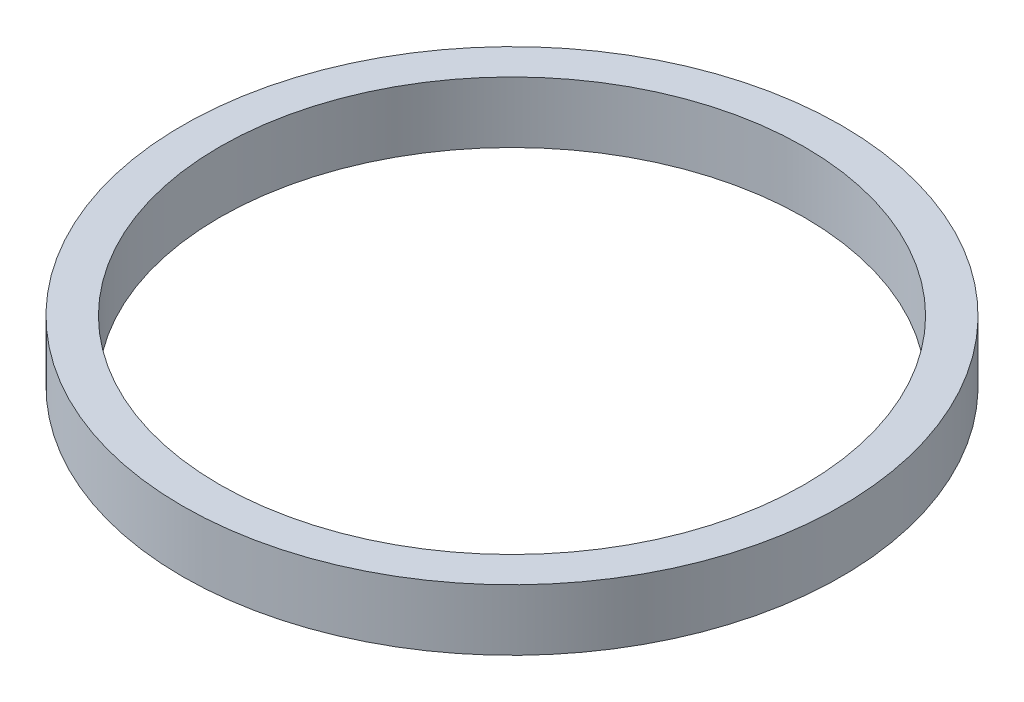
ISO-10303-21;
HEADER;
FILE_DESCRIPTION(('STEP AP214'),'2;1');
FILE_NAME('part.step','',(''),(''),'','','');
FILE_SCHEMA(('AUTOMOTIVE_DESIGN { 1 0 10303 214 1 1 1 1 }'));
ENDSEC;
DATA;
#1=APPLICATION_CONTEXT('core data for automotive mechanical design processes');
#2=APPLICATION_PROTOCOL_DEFINITION('international standard','automotive_design',2000,#1);
#3=PRODUCT_CONTEXT('',#1,'mechanical');
#4=PRODUCT('Part','Part','',(#3));
#5=PRODUCT_RELATED_PRODUCT_CATEGORY('part','',(#4));
#6=PRODUCT_DEFINITION_FORMATION('','',#4);
#7=PRODUCT_DEFINITION_CONTEXT('part definition',#1,'design');
#8=PRODUCT_DEFINITION('design','',#6,#7);
#9=PRODUCT_DEFINITION_SHAPE('','',#8);
#10=(LENGTH_UNIT() NAMED_UNIT(*) SI_UNIT(.MILLI.,.METRE.));
#11=(NAMED_UNIT(*) PLANE_ANGLE_UNIT() SI_UNIT($,.RADIAN.));
#12=(NAMED_UNIT(*) SI_UNIT($,.STERADIAN.) SOLID_ANGLE_UNIT());
#13=UNCERTAINTY_MEASURE_WITH_UNIT(LENGTH_MEASURE(1.E-05),#10,'distance_accuracy_value','');
#14=(GEOMETRIC_REPRESENTATION_CONTEXT(3) GLOBAL_UNCERTAINTY_ASSIGNED_CONTEXT((#13)) GLOBAL_UNIT_ASSIGNED_CONTEXT((#10,
#11,#12)) REPRESENTATION_CONTEXT('',''));
#15=CARTESIAN_POINT('',(0.,0.,0.));
#16=DIRECTION('',(0.,0.,1.));
#17=DIRECTION('',(1.,0.,0.));
#18=AXIS2_PLACEMENT_3D('',#15,#16,#17);
#19=CARTESIAN_POINT('',(0.,7.,0.));
#20=DIRECTION('',(0.,1.,0.));
#21=DIRECTION('',(0.,0.,1.));
#22=AXIS2_PLACEMENT_3D('',#19,#20,#21);
#23=PLANE('',#22);
#24=CARTESIAN_POINT('',(0.,7.,0.));
#25=DIRECTION('',(0.,1.,0.));
#26=DIRECTION('',(0.,0.,1.));
#27=AXIS2_PLACEMENT_3D('',#24,#25,#26);
#28=CIRCLE('',#27,37.75);
#29=CARTESIAN_POINT('',(0.,7.,37.75));
#30=VERTEX_POINT('',#29);
#31=EDGE_CURVE('E10',#30,#30,#28,.T.);
#32=ORIENTED_EDGE('',*,*,#31,.T.);
#33=EDGE_LOOP('',(#32));
#34=FACE_BOUND('',#33,.T.);
#35=CARTESIAN_POINT('',(-2.88140372107266E-13,7.,-1.19531961936437E-12));
#36=DIRECTION('',(0.,1.,0.));
#37=DIRECTION('',(0.,0.,1.));
#38=AXIS2_PLACEMENT_3D('',#35,#36,#37);
#39=CIRCLE('',#38,33.5);
#40=CARTESIAN_POINT('',(-2.88140372107266E-13,7.,33.4999999999988));
#41=VERTEX_POINT('',#40);
#42=EDGE_CURVE('E42',#41,#41,#39,.T.);
#43=ORIENTED_EDGE('',*,*,#42,.F.);
#44=EDGE_LOOP('',(#43));
#45=FACE_BOUND('',#44,.T.);
#46=ADVANCED_FACE('F31',(#34,#45),#23,.T.);
#47=CARTESIAN_POINT('',(0.,0.,0.));
#48=DIRECTION('',(0.,1.,0.));
#49=DIRECTION('',(0.,0.,1.));
#50=AXIS2_PLACEMENT_3D('',#47,#48,#49);
#51=PLANE('',#50);
#52=CARTESIAN_POINT('',(0.,0.,0.));
#53=DIRECTION('',(0.,1.,0.));
#54=DIRECTION('',(0.,0.,1.));
#55=AXIS2_PLACEMENT_3D('',#52,#53,#54);
#56=CIRCLE('',#55,37.75);
#57=CARTESIAN_POINT('',(0.,0.,37.75));
#58=VERTEX_POINT('',#57);
#59=EDGE_CURVE('E35',#58,#58,#56,.T.);
#60=ORIENTED_EDGE('',*,*,#59,.F.);
#61=EDGE_LOOP('',(#60));
#62=FACE_BOUND('',#61,.T.);
#63=CARTESIAN_POINT('',(-2.88140372107266E-13,0.,-1.19531961936437E-12));
#64=DIRECTION('',(0.,1.,0.));
#65=DIRECTION('',(0.,0.,1.));
#66=AXIS2_PLACEMENT_3D('',#63,#64,#65);
#67=CIRCLE('',#66,33.5);
#68=CARTESIAN_POINT('',(-2.88140372107266E-13,0.,33.4999999999988));
#69=VERTEX_POINT('',#68);
#70=EDGE_CURVE('E44',#69,#69,#67,.T.);
#71=ORIENTED_EDGE('',*,*,#70,.T.);
#72=EDGE_LOOP('',(#71));
#73=FACE_BOUND('',#72,.T.);
#74=ADVANCED_FACE('F54',(#62,#73),#51,.F.);
#75=CARTESIAN_POINT('',(0.,7.,0.));
#76=DIRECTION('',(0.,-1.,0.));
#77=DIRECTION('',(0.,0.,-1.));
#78=AXIS2_PLACEMENT_3D('',#75,#76,#77);
#79=CYLINDRICAL_SURFACE('',#78,37.75);
#80=ORIENTED_EDGE('',*,*,#31,.F.);
#81=EDGE_LOOP('',(#80));
#82=FACE_BOUND('',#81,.T.);
#83=ORIENTED_EDGE('',*,*,#59,.T.);
#84=EDGE_LOOP('',(#83));
#85=FACE_BOUND('',#84,.T.);
#86=ADVANCED_FACE('F33',(#82,#85),#79,.T.);
#87=CARTESIAN_POINT('',(-2.88140372107266E-13,7.,-1.19531961936437E-12));
#88=DIRECTION('',(0.,-1.,0.));
#89=DIRECTION('',(0.,0.,-1.));
#90=AXIS2_PLACEMENT_3D('',#87,#88,#89);
#91=CYLINDRICAL_SURFACE('',#90,33.5);
#92=ORIENTED_EDGE('',*,*,#42,.T.);
#93=EDGE_LOOP('',(#92));
#94=FACE_BOUND('',#93,.T.);
#95=ORIENTED_EDGE('',*,*,#70,.F.);
#96=EDGE_LOOP('',(#95));
#97=FACE_BOUND('',#96,.T.);
#98=ADVANCED_FACE('F50',(#94,#97),#91,.F.);
#99=CLOSED_SHELL('',(#46,#74,#86,#98));
#100=MANIFOLD_SOLID_BREP('B2',#99);
#101=ADVANCED_BREP_SHAPE_REPRESENTATION('',(#18,#100),#14);
#102=SHAPE_DEFINITION_REPRESENTATION(#9,#101);
ENDSEC;
END-ISO-10303-21;
